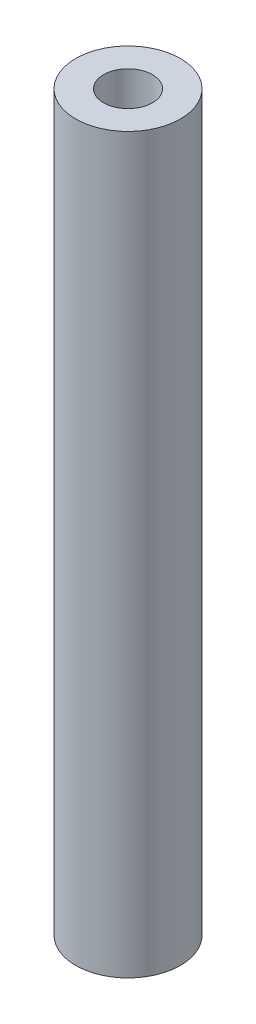
ISO-10303-21;
HEADER;
FILE_DESCRIPTION(('STEP AP214'),'2;1');
FILE_NAME('part.step','',(''),(''),'','','');
FILE_SCHEMA(('AUTOMOTIVE_DESIGN { 1 0 10303 214 1 1 1 1 }'));
ENDSEC;
DATA;
#1=APPLICATION_CONTEXT('core data for automotive mechanical design processes');
#2=APPLICATION_PROTOCOL_DEFINITION('international standard','automotive_design',2000,#1);
#3=PRODUCT_CONTEXT('',#1,'mechanical');
#4=PRODUCT('Part','Part','',(#3));
#5=PRODUCT_RELATED_PRODUCT_CATEGORY('part','',(#4));
#6=PRODUCT_DEFINITION_FORMATION('','',#4);
#7=PRODUCT_DEFINITION_CONTEXT('part definition',#1,'design');
#8=PRODUCT_DEFINITION('design','',#6,#7);
#9=PRODUCT_DEFINITION_SHAPE('','',#8);
#10=(LENGTH_UNIT() NAMED_UNIT(*) SI_UNIT(.MILLI.,.METRE.));
#11=(NAMED_UNIT(*) PLANE_ANGLE_UNIT() SI_UNIT($,.RADIAN.));
#12=(NAMED_UNIT(*) SI_UNIT($,.STERADIAN.) SOLID_ANGLE_UNIT());
#13=UNCERTAINTY_MEASURE_WITH_UNIT(LENGTH_MEASURE(1.E-05),#10,'distance_accuracy_value','');
#14=(GEOMETRIC_REPRESENTATION_CONTEXT(3) GLOBAL_UNCERTAINTY_ASSIGNED_CONTEXT((#13)) GLOBAL_UNIT_ASSIGNED_CONTEXT((#10,
#11,#12)) REPRESENTATION_CONTEXT('',''));
#15=CARTESIAN_POINT('',(0.,0.,0.));
#16=DIRECTION('',(0.,0.,1.));
#17=DIRECTION('',(1.,0.,0.));
#18=AXIS2_PLACEMENT_3D('',#15,#16,#17);
#19=CARTESIAN_POINT('',(0.,42.,0.));
#20=DIRECTION('',(0.,-1.,0.));
#21=DIRECTION('',(0.,0.,-1.));
#22=AXIS2_PLACEMENT_3D('',#19,#20,#21);
#23=CYLINDRICAL_SURFACE('',#22,1.4);
#24=CARTESIAN_POINT('',(0.,0.,0.));
#25=DIRECTION('',(0.,1.,0.));
#26=DIRECTION('',(0.,0.,1.));
#27=AXIS2_PLACEMENT_3D('',#24,#25,#26);
#28=CIRCLE('',#27,1.4);
#29=CARTESIAN_POINT('',(0.,0.,-1.4));
#30=VERTEX_POINT('',#29);
#31=EDGE_CURVE('E54',#30,#30,#28,.T.);
#32=CARTESIAN_POINT('',(0.,10.,0.));
#33=DIRECTION('',(0.,1.,0.));
#34=DIRECTION('',(0.,0.,1.));
#35=AXIS2_PLACEMENT_3D('',#32,#33,#34);
#36=CIRCLE('',#35,1.4);
#37=CARTESIAN_POINT('',(0.,9.99999999999999,-1.4));
#38=VERTEX_POINT('',#37);
#39=EDGE_CURVE('E56',#38,#38,#36,.T.);
#40=CARTESIAN_POINT('',(0.,0.,-1.4));
#41=CARTESIAN_POINT('',(0.,0.104166666666667,-1.4));
#42=CARTESIAN_POINT('',(0.,0.208333333333334,-1.4));
#43=CARTESIAN_POINT('',(0.,0.416666666666667,-1.4));
#44=CARTESIAN_POINT('',(0.,0.520833333333334,-1.4));
#45=CARTESIAN_POINT('',(0.,0.729166666666667,-1.4));
#46=CARTESIAN_POINT('',(0.,0.833333333333334,-1.4));
#47=CARTESIAN_POINT('',(0.,1.04166666666667,-1.4));
#48=CARTESIAN_POINT('',(0.,1.14583333333333,-1.4));
#49=CARTESIAN_POINT('',(0.,1.35416666666667,-1.4));
#50=CARTESIAN_POINT('',(0.,1.45833333333333,-1.4));
#51=CARTESIAN_POINT('',(0.,1.66666666666667,-1.4));
#52=CARTESIAN_POINT('',(0.,1.77083333333334,-1.4));
#53=CARTESIAN_POINT('',(0.,1.97916666666667,-1.4));
#54=CARTESIAN_POINT('',(0.,2.08333333333334,-1.4));
#55=CARTESIAN_POINT('',(0.,2.29166666666667,-1.4));
#56=CARTESIAN_POINT('',(0.,2.39583333333334,-1.4));
#57=CARTESIAN_POINT('',(0.,2.60416666666667,-1.4));
#58=CARTESIAN_POINT('',(0.,2.70833333333333,-1.4));
#59=CARTESIAN_POINT('',(0.,2.91666666666666,-1.4));
#60=CARTESIAN_POINT('',(0.,3.02083333333333,-1.4));
#61=CARTESIAN_POINT('',(0.,3.22916666666666,-1.4));
#62=CARTESIAN_POINT('',(0.,3.33333333333333,-1.4));
#63=CARTESIAN_POINT('',(0.,3.54166666666666,-1.4));
#64=CARTESIAN_POINT('',(0.,3.64583333333333,-1.4));
#65=CARTESIAN_POINT('',(0.,3.85416666666666,-1.4));
#66=CARTESIAN_POINT('',(0.,3.95833333333333,-1.4));
#67=CARTESIAN_POINT('',(0.,4.16666666666666,-1.4));
#68=CARTESIAN_POINT('',(0.,4.27083333333333,-1.4));
#69=CARTESIAN_POINT('',(0.,4.47916666666666,-1.4));
#70=CARTESIAN_POINT('',(0.,4.58333333333333,-1.4));
#71=CARTESIAN_POINT('',(0.,4.79166666666666,-1.4));
#72=CARTESIAN_POINT('',(0.,4.89583333333333,-1.4));
#73=CARTESIAN_POINT('',(0.,5.10416666666666,-1.4));
#74=CARTESIAN_POINT('',(0.,5.20833333333333,-1.4));
#75=CARTESIAN_POINT('',(0.,5.41666666666666,-1.4));
#76=CARTESIAN_POINT('',(0.,5.52083333333333,-1.4));
#77=CARTESIAN_POINT('',(0.,5.72916666666666,-1.4));
#78=CARTESIAN_POINT('',(0.,5.83333333333333,-1.4));
#79=CARTESIAN_POINT('',(0.,6.04166666666667,-1.4));
#80=CARTESIAN_POINT('',(0.,6.14583333333333,-1.4));
#81=CARTESIAN_POINT('',(0.,6.35416666666667,-1.4));
#82=CARTESIAN_POINT('',(0.,6.45833333333333,-1.4));
#83=CARTESIAN_POINT('',(0.,6.66666666666667,-1.4));
#84=CARTESIAN_POINT('',(0.,6.77083333333333,-1.4));
#85=CARTESIAN_POINT('',(0.,6.97916666666667,-1.4));
#86=CARTESIAN_POINT('',(0.,7.08333333333333,-1.4));
#87=CARTESIAN_POINT('',(0.,7.29166666666666,-1.4));
#88=CARTESIAN_POINT('',(0.,7.39583333333333,-1.4));
#89=CARTESIAN_POINT('',(0.,7.60416666666666,-1.4));
#90=CARTESIAN_POINT('',(0.,7.70833333333333,-1.4));
#91=CARTESIAN_POINT('',(0.,7.91666666666666,-1.4));
#92=CARTESIAN_POINT('',(0.,8.02083333333333,-1.4));
#93=CARTESIAN_POINT('',(0.,8.22916666666666,-1.4));
#94=CARTESIAN_POINT('',(0.,8.33333333333333,-1.4));
#95=CARTESIAN_POINT('',(0.,8.54166666666666,-1.4));
#96=CARTESIAN_POINT('',(0.,8.64583333333333,-1.4));
#97=CARTESIAN_POINT('',(0.,8.85416666666666,-1.4));
#98=CARTESIAN_POINT('',(0.,8.95833333333333,-1.4));
#99=CARTESIAN_POINT('',(0.,9.16666666666666,-1.4));
#100=CARTESIAN_POINT('',(0.,9.27083333333333,-1.4));
#101=CARTESIAN_POINT('',(0.,9.47916666666666,-1.4));
#102=CARTESIAN_POINT('',(0.,9.58333333333333,-1.4));
#103=CARTESIAN_POINT('',(0.,9.79166666666666,-1.4));
#104=CARTESIAN_POINT('',(0.,9.89583333333333,-1.4));
#105=CARTESIAN_POINT('',(0.,9.99999999999999,-1.4));
#106=B_SPLINE_CURVE_WITH_KNOTS('',3,(#40,#41,#42,#43,#44,#45,#46,#47,#48,#49,#50,#51,#52,#53,
#54,#55,#56,#57,#58,#59,#60,#61,#62,#63,#64,#65,#66,#67,#68,#69,#70,#71,#72,#73,#74,#75,#76,#77,
#78,#79,#80,#81,#82,#83,#84,#85,#86,#87,#88,#89,#90,#91,#92,#93,#94,#95,#96,#97,#98,#99,#100,
#101,#102,#103,#104,#105),.UNSPECIFIED.,.F.,.F.,(4,2,2,2,2,2,2,2,2,2,2,2,2,2,2,2,2,2,2,2,2,2,2,
2,2,2,2,2,2,2,2,2,4),(0.,0.3125,0.625000000000001,0.937500000000001,1.25,1.5625,1.875,2.1875,
2.5,2.8125,3.125,3.4375,3.75,4.0625,4.375,4.6875,5.,5.3125,5.625,5.9375,6.25,6.5625,6.875,
7.1875,7.49999999999999,7.8125,8.12499999999999,8.43749999999999,8.74999999999999,
9.06249999999999,9.37499999999999,9.68749999999999,9.99999999999999),.UNSPECIFIED.);
#107=EDGE_CURVE('BSEAM34',#30,#38,#106,.T.);
#108=ORIENTED_EDGE('',*,*,#31,.F.);
#109=ORIENTED_EDGE('',*,*,#39,.T.);
#110=ORIENTED_EDGE('',*,*,#107,.T.);
#111=ORIENTED_EDGE('',*,*,#107,.F.);
#112=EDGE_LOOP('',(#108,#110,#109,#111));
#113=FACE_BOUND('',#112,.T.);
#114=ADVANCED_FACE('F34',(#113),#23,.F.);
#115=CARTESIAN_POINT('',(0.,32.,0.));
#116=DIRECTION('',(0.,1.,0.));
#117=DIRECTION('',(0.,0.,1.));
#118=AXIS2_PLACEMENT_3D('',#115,#116,#117);
#119=CIRCLE('',#118,1.4);
#120=CARTESIAN_POINT('',(0.,32.,-1.4));
#121=VERTEX_POINT('',#120);
#122=EDGE_CURVE('E10',#121,#121,#119,.T.);
#123=CARTESIAN_POINT('',(0.,42.,0.));
#124=DIRECTION('',(0.,1.,0.));
#125=DIRECTION('',(0.,0.,1.));
#126=AXIS2_PLACEMENT_3D('',#123,#124,#125);
#127=CIRCLE('',#126,1.4);
#128=CARTESIAN_POINT('',(0.,42.,-1.4));
#129=VERTEX_POINT('',#128);
#130=EDGE_CURVE('E45',#129,#129,#127,.T.);
#131=CARTESIAN_POINT('',(0.,32.,-1.4));
#132=CARTESIAN_POINT('',(0.,32.1041666666667,-1.4));
#133=CARTESIAN_POINT('',(0.,32.2083333333333,-1.4));
#134=CARTESIAN_POINT('',(0.,32.4166666666667,-1.4));
#135=CARTESIAN_POINT('',(0.,32.5208333333333,-1.4));
#136=CARTESIAN_POINT('',(0.,32.7291666666667,-1.4));
#137=CARTESIAN_POINT('',(0.,32.8333333333333,-1.4));
#138=CARTESIAN_POINT('',(0.,33.0416666666667,-1.4));
#139=CARTESIAN_POINT('',(0.,33.1458333333333,-1.4));
#140=CARTESIAN_POINT('',(0.,33.3541666666667,-1.4));
#141=CARTESIAN_POINT('',(0.,33.4583333333333,-1.4));
#142=CARTESIAN_POINT('',(0.,33.6666666666667,-1.4));
#143=CARTESIAN_POINT('',(0.,33.7708333333333,-1.4));
#144=CARTESIAN_POINT('',(0.,33.9791666666667,-1.4));
#145=CARTESIAN_POINT('',(0.,34.0833333333333,-1.4));
#146=CARTESIAN_POINT('',(0.,34.2916666666667,-1.4));
#147=CARTESIAN_POINT('',(0.,34.3958333333333,-1.4));
#148=CARTESIAN_POINT('',(0.,34.6041666666667,-1.4));
#149=CARTESIAN_POINT('',(0.,34.7083333333333,-1.4));
#150=CARTESIAN_POINT('',(0.,34.9166666666667,-1.4));
#151=CARTESIAN_POINT('',(0.,35.0208333333333,-1.4));
#152=CARTESIAN_POINT('',(0.,35.2291666666667,-1.4));
#153=CARTESIAN_POINT('',(0.,35.3333333333333,-1.4));
#154=CARTESIAN_POINT('',(0.,35.5416666666667,-1.4));
#155=CARTESIAN_POINT('',(0.,35.6458333333333,-1.4));
#156=CARTESIAN_POINT('',(0.,35.8541666666667,-1.4));
#157=CARTESIAN_POINT('',(0.,35.9583333333333,-1.4));
#158=CARTESIAN_POINT('',(0.,36.1666666666667,-1.4));
#159=CARTESIAN_POINT('',(0.,36.2708333333333,-1.4));
#160=CARTESIAN_POINT('',(0.,36.4791666666667,-1.4));
#161=CARTESIAN_POINT('',(0.,36.5833333333333,-1.4));
#162=CARTESIAN_POINT('',(0.,36.7916666666667,-1.4));
#163=CARTESIAN_POINT('',(0.,36.8958333333333,-1.4));
#164=CARTESIAN_POINT('',(0.,37.1041666666667,-1.4));
#165=CARTESIAN_POINT('',(0.,37.2083333333333,-1.4));
#166=CARTESIAN_POINT('',(0.,37.4166666666667,-1.4));
#167=CARTESIAN_POINT('',(0.,37.5208333333333,-1.4));
#168=CARTESIAN_POINT('',(0.,37.7291666666667,-1.4));
#169=CARTESIAN_POINT('',(0.,37.8333333333333,-1.4));
#170=CARTESIAN_POINT('',(0.,38.0416666666667,-1.4));
#171=CARTESIAN_POINT('',(0.,38.1458333333333,-1.4));
#172=CARTESIAN_POINT('',(0.,38.3541666666667,-1.4));
#173=CARTESIAN_POINT('',(0.,38.4583333333333,-1.4));
#174=CARTESIAN_POINT('',(0.,38.6666666666667,-1.4));
#175=CARTESIAN_POINT('',(0.,38.7708333333333,-1.4));
#176=CARTESIAN_POINT('',(0.,38.9791666666667,-1.4));
#177=CARTESIAN_POINT('',(0.,39.0833333333333,-1.4));
#178=CARTESIAN_POINT('',(0.,39.2916666666667,-1.4));
#179=CARTESIAN_POINT('',(0.,39.3958333333333,-1.4));
#180=CARTESIAN_POINT('',(0.,39.6041666666667,-1.4));
#181=CARTESIAN_POINT('',(0.,39.7083333333333,-1.4));
#182=CARTESIAN_POINT('',(0.,39.9166666666667,-1.4));
#183=CARTESIAN_POINT('',(0.,40.0208333333333,-1.4));
#184=CARTESIAN_POINT('',(0.,40.2291666666667,-1.4));
#185=CARTESIAN_POINT('',(0.,40.3333333333333,-1.4));
#186=CARTESIAN_POINT('',(0.,40.5416666666667,-1.4));
#187=CARTESIAN_POINT('',(0.,40.6458333333333,-1.4));
#188=CARTESIAN_POINT('',(0.,40.8541666666667,-1.4));
#189=CARTESIAN_POINT('',(0.,40.9583333333333,-1.4));
#190=CARTESIAN_POINT('',(0.,41.1666666666667,-1.4));
#191=CARTESIAN_POINT('',(0.,41.2708333333333,-1.4));
#192=CARTESIAN_POINT('',(0.,41.4791666666667,-1.4));
#193=CARTESIAN_POINT('',(0.,41.5833333333333,-1.4));
#194=CARTESIAN_POINT('',(0.,41.7916666666667,-1.4));
#195=CARTESIAN_POINT('',(0.,41.8958333333333,-1.4));
#196=CARTESIAN_POINT('',(0.,42.,-1.4));
#197=B_SPLINE_CURVE_WITH_KNOTS('',3,(#131,#132,#133,#134,#135,#136,#137,#138,#139,#140,#141,
#142,#143,#144,#145,#146,#147,#148,#149,#150,#151,#152,#153,#154,#155,#156,#157,#158,#159,#160,
#161,#162,#163,#164,#165,#166,#167,#168,#169,#170,#171,#172,#173,#174,#175,#176,#177,#178,#179,
#180,#181,#182,#183,#184,#185,#186,#187,#188,#189,#190,#191,#192,#193,#194,#195,#196),
.UNSPECIFIED.,.F.,.F.,(4,2,2,2,2,2,2,2,2,2,2,2,2,2,2,2,2,2,2,2,2,2,2,2,2,2,2,2,2,2,2,2,4),(0.,
0.3125,0.625000000000001,0.937500000000001,1.25,1.5625,1.875,2.1875,2.5,2.8125,3.125,3.4375,
3.75,4.0625,4.375,4.6875,5.,5.3125,5.62500000000001,5.93750000000001,6.25000000000001,
6.56250000000001,6.87500000000001,7.18750000000001,7.50000000000001,7.81250000000001,
8.12500000000001,8.43750000000001,8.75000000000001,9.06250000000001,9.37500000000001,
9.68750000000001,10.),.UNSPECIFIED.);
#198=EDGE_CURVE('BSEAM36',#121,#129,#197,.T.);
#199=ORIENTED_EDGE('',*,*,#122,.F.);
#200=ORIENTED_EDGE('',*,*,#130,.T.);
#201=ORIENTED_EDGE('',*,*,#198,.T.);
#202=ORIENTED_EDGE('',*,*,#198,.F.);
#203=EDGE_LOOP('',(#199,#201,#200,#202));
#204=FACE_BOUND('',#203,.T.);
#205=ADVANCED_FACE('F36',(#204),#23,.F.);
#206=CARTESIAN_POINT('',(0.,42.,0.));
#207=DIRECTION('',(0.,-1.,0.));
#208=DIRECTION('',(0.,0.,-1.));
#209=AXIS2_PLACEMENT_3D('',#206,#207,#208);
#210=CYLINDRICAL_SURFACE('',#209,3.);
#211=CARTESIAN_POINT('',(0.,42.,0.));
#212=DIRECTION('',(0.,1.,0.));
#213=DIRECTION('',(0.,0.,1.));
#214=AXIS2_PLACEMENT_3D('',#211,#212,#213);
#215=CIRCLE('',#214,3.);
#216=CARTESIAN_POINT('',(0.,42.,-3.));
#217=VERTEX_POINT('',#216);
#218=EDGE_CURVE('E41',#217,#217,#215,.T.);
#219=CARTESIAN_POINT('',(0.,0.,0.));
#220=DIRECTION('',(0.,1.,0.));
#221=DIRECTION('',(0.,0.,1.));
#222=AXIS2_PLACEMENT_3D('',#219,#220,#221);
#223=CIRCLE('',#222,3.);
#224=CARTESIAN_POINT('',(0.,0.,-3.));
#225=VERTEX_POINT('',#224);
#226=EDGE_CURVE('E50',#225,#225,#223,.T.);
#227=CARTESIAN_POINT('',(0.,42.,-3.));
#228=CARTESIAN_POINT('',(0.,41.5625,-3.));
#229=CARTESIAN_POINT('',(0.,41.125,-3.));
#230=CARTESIAN_POINT('',(0.,40.25,-3.));
#231=CARTESIAN_POINT('',(0.,39.8125,-3.));
#232=CARTESIAN_POINT('',(0.,38.9375,-3.));
#233=CARTESIAN_POINT('',(0.,38.5,-3.));
#234=CARTESIAN_POINT('',(0.,37.625,-3.));
#235=CARTESIAN_POINT('',(0.,37.1875,-3.));
#236=CARTESIAN_POINT('',(0.,36.3125,-3.));
#237=CARTESIAN_POINT('',(0.,35.875,-3.));
#238=CARTESIAN_POINT('',(0.,35.,-3.));
#239=CARTESIAN_POINT('',(0.,34.5625,-3.));
#240=CARTESIAN_POINT('',(0.,33.6875,-3.));
#241=CARTESIAN_POINT('',(0.,33.25,-3.));
#242=CARTESIAN_POINT('',(0.,32.375,-3.));
#243=CARTESIAN_POINT('',(0.,31.9375,-3.));
#244=CARTESIAN_POINT('',(0.,31.0625,-3.));
#245=CARTESIAN_POINT('',(0.,30.625,-3.));
#246=CARTESIAN_POINT('',(0.,29.75,-3.));
#247=CARTESIAN_POINT('',(0.,29.3125,-3.));
#248=CARTESIAN_POINT('',(0.,28.4375,-3.));
#249=CARTESIAN_POINT('',(0.,28.,-3.));
#250=CARTESIAN_POINT('',(0.,27.125,-3.));
#251=CARTESIAN_POINT('',(0.,26.6875,-3.));
#252=CARTESIAN_POINT('',(0.,25.8125,-3.));
#253=CARTESIAN_POINT('',(0.,25.375,-3.));
#254=CARTESIAN_POINT('',(0.,24.5,-3.));
#255=CARTESIAN_POINT('',(0.,24.0625,-3.));
#256=CARTESIAN_POINT('',(0.,23.1875,-3.));
#257=CARTESIAN_POINT('',(0.,22.75,-3.));
#258=CARTESIAN_POINT('',(0.,21.875,-3.));
#259=CARTESIAN_POINT('',(0.,21.4375,-3.));
#260=CARTESIAN_POINT('',(0.,20.5625,-3.));
#261=CARTESIAN_POINT('',(0.,20.125,-3.));
#262=CARTESIAN_POINT('',(0.,19.25,-3.));
#263=CARTESIAN_POINT('',(0.,18.8125,-3.));
#264=CARTESIAN_POINT('',(0.,17.9375,-3.));
#265=CARTESIAN_POINT('',(0.,17.5,-3.));
#266=CARTESIAN_POINT('',(0.,16.625,-3.));
#267=CARTESIAN_POINT('',(0.,16.1875,-3.));
#268=CARTESIAN_POINT('',(0.,15.3125,-3.));
#269=CARTESIAN_POINT('',(0.,14.875,-3.));
#270=CARTESIAN_POINT('',(0.,14.,-3.));
#271=CARTESIAN_POINT('',(0.,13.5625,-3.));
#272=CARTESIAN_POINT('',(0.,12.6875,-3.));
#273=CARTESIAN_POINT('',(0.,12.25,-3.));
#274=CARTESIAN_POINT('',(0.,11.375,-3.));
#275=CARTESIAN_POINT('',(0.,10.9375,-3.));
#276=CARTESIAN_POINT('',(0.,10.0625,-3.));
#277=CARTESIAN_POINT('',(0.,9.625,-3.));
#278=CARTESIAN_POINT('',(0.,8.75,-3.));
#279=CARTESIAN_POINT('',(0.,8.3125,-3.));
#280=CARTESIAN_POINT('',(0.,7.4375,-3.));
#281=CARTESIAN_POINT('',(0.,7.,-3.));
#282=CARTESIAN_POINT('',(0.,6.125,-3.));
#283=CARTESIAN_POINT('',(0.,5.6875,-3.));
#284=CARTESIAN_POINT('',(0.,4.8125,-3.));
#285=CARTESIAN_POINT('',(0.,4.375,-3.));
#286=CARTESIAN_POINT('',(0.,3.5,-3.));
#287=CARTESIAN_POINT('',(0.,3.0625,-3.));
#288=CARTESIAN_POINT('',(0.,2.1875,-3.));
#289=CARTESIAN_POINT('',(0.,1.75,-3.));
#290=CARTESIAN_POINT('',(0.,0.875000000000001,-3.));
#291=CARTESIAN_POINT('',(0.,0.4375,-3.));
#292=CARTESIAN_POINT('',(0.,0.,-3.));
#293=B_SPLINE_CURVE_WITH_KNOTS('',3,(#227,#228,#229,#230,#231,#232,#233,#234,#235,#236,#237,
#238,#239,#240,#241,#242,#243,#244,#245,#246,#247,#248,#249,#250,#251,#252,#253,#254,#255,#256,
#257,#258,#259,#260,#261,#262,#263,#264,#265,#266,#267,#268,#269,#270,#271,#272,#273,#274,#275,
#276,#277,#278,#279,#280,#281,#282,#283,#284,#285,#286,#287,#288,#289,#290,#291,#292),
.UNSPECIFIED.,.F.,.F.,(4,2,2,2,2,2,2,2,2,2,2,2,2,2,2,2,2,2,2,2,2,2,2,2,2,2,2,2,2,2,2,2,4),(0.,
1.31249999999999,2.625,3.9375,5.25,6.5625,7.87499999999999,9.18749999999999,10.5,11.8125,13.125,
14.4375,15.75,17.0625,18.375,19.6875,21.,22.3125,23.625,24.9375,26.25,27.5625,28.875,30.1875,
31.5,32.8125,34.125,35.4375,36.75,38.0625,39.375,40.6875,42.),.UNSPECIFIED.);
#294=EDGE_CURVE('BSEAM60',#217,#225,#293,.T.);
#295=ORIENTED_EDGE('',*,*,#218,.F.);
#296=ORIENTED_EDGE('',*,*,#226,.T.);
#297=ORIENTED_EDGE('',*,*,#294,.T.);
#298=ORIENTED_EDGE('',*,*,#294,.F.);
#299=EDGE_LOOP('',(#295,#297,#296,#298));
#300=FACE_BOUND('',#299,.T.);
#301=ADVANCED_FACE('F60',(#300),#210,.T.);
#302=CARTESIAN_POINT('',(0.,42.,0.));
#303=DIRECTION('',(0.,1.,0.));
#304=DIRECTION('',(0.,0.,1.));
#305=AXIS2_PLACEMENT_3D('',#302,#303,#304);
#306=PLANE('',#305);
#307=ORIENTED_EDGE('',*,*,#130,.F.);
#308=EDGE_LOOP('',(#307));
#309=FACE_BOUND('',#308,.T.);
#310=ORIENTED_EDGE('',*,*,#218,.T.);
#311=EDGE_LOOP('',(#310));
#312=FACE_BOUND('',#311,.T.);
#313=ADVANCED_FACE('F65',(#309,#312),#306,.T.);
#314=CARTESIAN_POINT('',(0.,0.,0.));
#315=DIRECTION('',(0.,1.,0.));
#316=DIRECTION('',(0.,0.,1.));
#317=AXIS2_PLACEMENT_3D('',#314,#315,#316);
#318=PLANE('',#317);
#319=ORIENTED_EDGE('',*,*,#31,.T.);
#320=EDGE_LOOP('',(#319));
#321=FACE_BOUND('',#320,.T.);
#322=ORIENTED_EDGE('',*,*,#226,.F.);
#323=EDGE_LOOP('',(#322));
#324=FACE_BOUND('',#323,.T.);
#325=ADVANCED_FACE('F62',(#321,#324),#318,.F.);
#326=CARTESIAN_POINT('',(0.,10.,0.));
#327=DIRECTION('',(0.,1.,0.));
#328=DIRECTION('',(0.,0.,1.));
#329=AXIS2_PLACEMENT_3D('',#326,#327,#328);
#330=PLANE('',#329);
#331=ORIENTED_EDGE('',*,*,#39,.F.);
#332=EDGE_LOOP('',(#331));
#333=FACE_BOUND('',#332,.T.);
#334=ADVANCED_FACE('F64',(#333),#330,.F.);
#335=CARTESIAN_POINT('',(0.,32.,0.));
#336=DIRECTION('',(0.,1.,0.));
#337=DIRECTION('',(0.,0.,1.));
#338=AXIS2_PLACEMENT_3D('',#335,#336,#337);
#339=PLANE('',#338);
#340=ORIENTED_EDGE('',*,*,#122,.T.);
#341=EDGE_LOOP('',(#340));
#342=FACE_BOUND('',#341,.T.);
#343=ADVANCED_FACE('F72',(#342),#339,.T.);
#344=CLOSED_SHELL('',(#114,#205,#301,#313,#325,#334,#343));
#345=MANIFOLD_SOLID_BREP('B2',#344);
#346=ADVANCED_BREP_SHAPE_REPRESENTATION('',(#18,#345),#14);
#347=SHAPE_DEFINITION_REPRESENTATION(#9,#346);
ENDSEC;
END-ISO-10303-21;
